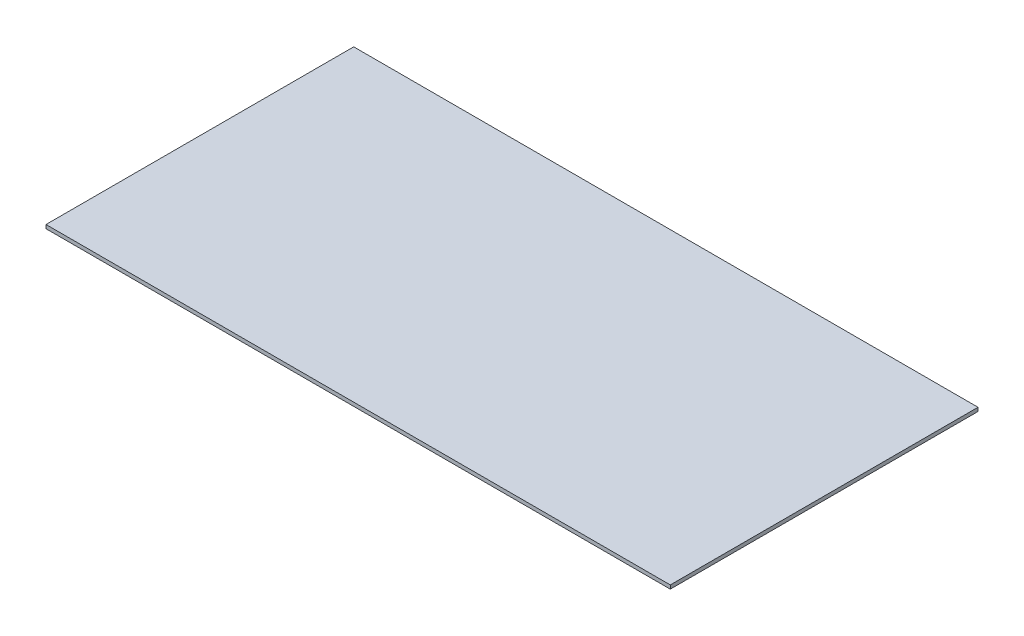
ISO-10303-21;
HEADER;
FILE_DESCRIPTION(('STEP AP214'),'2;1');
FILE_NAME('part.step','',(''),(''),'','','');
FILE_SCHEMA(('AUTOMOTIVE_DESIGN { 1 0 10303 214 1 1 1 1 }'));
ENDSEC;
DATA;
#1=APPLICATION_CONTEXT('core data for automotive mechanical design processes');
#2=APPLICATION_PROTOCOL_DEFINITION('international standard','automotive_design',2000,#1);
#3=PRODUCT_CONTEXT('',#1,'mechanical');
#4=PRODUCT('Part','Part','',(#3));
#5=PRODUCT_RELATED_PRODUCT_CATEGORY('part','',(#4));
#6=PRODUCT_DEFINITION_FORMATION('','',#4);
#7=PRODUCT_DEFINITION_CONTEXT('part definition',#1,'design');
#8=PRODUCT_DEFINITION('design','',#6,#7);
#9=PRODUCT_DEFINITION_SHAPE('','',#8);
#10=(LENGTH_UNIT() NAMED_UNIT(*) SI_UNIT(.MILLI.,.METRE.));
#11=(NAMED_UNIT(*) PLANE_ANGLE_UNIT() SI_UNIT($,.RADIAN.));
#12=(NAMED_UNIT(*) SI_UNIT($,.STERADIAN.) SOLID_ANGLE_UNIT());
#13=UNCERTAINTY_MEASURE_WITH_UNIT(LENGTH_MEASURE(1.E-05),#10,'distance_accuracy_value','');
#14=(GEOMETRIC_REPRESENTATION_CONTEXT(3) GLOBAL_UNCERTAINTY_ASSIGNED_CONTEXT((#13)) GLOBAL_UNIT_ASSIGNED_CONTEXT((#10,
#11,#12)) REPRESENTATION_CONTEXT('',''));
#15=CARTESIAN_POINT('',(0.,0.,0.));
#16=DIRECTION('',(0.,0.,1.));
#17=DIRECTION('',(1.,0.,0.));
#18=AXIS2_PLACEMENT_3D('',#15,#16,#17);
#19=CARTESIAN_POINT('',(0.,1.5875,0.));
#20=DIRECTION('',(1.,0.,0.));
#21=DIRECTION('',(0.,0.,-1.));
#22=AXIS2_PLACEMENT_3D('',#19,#20,#21);
#23=PLANE('',#22);
#24=DIRECTION('',(0.,0.,1.));
#25=VECTOR('',#24,1.);
#26=CARTESIAN_POINT('',(0.,0.,0.));
#27=LINE('',#26,#25);
#28=CARTESIAN_POINT('',(0.,0.,-132.588));
#29=VERTEX_POINT('',#28);
#30=CARTESIAN_POINT('',(0.,0.,0.));
#31=VERTEX_POINT('',#30);
#32=EDGE_CURVE('E96',#29,#31,#27,.T.);
#33=ORIENTED_EDGE('',*,*,#32,.T.);
#34=DIRECTION('',(0.,-1.,0.));
#35=VECTOR('',#34,1.);
#36=CARTESIAN_POINT('',(0.,1.5875,0.));
#37=LINE('',#36,#35);
#38=CARTESIAN_POINT('',(0.,1.5875,0.));
#39=VERTEX_POINT('',#38);
#40=EDGE_CURVE('E11',#39,#31,#37,.T.);
#41=ORIENTED_EDGE('',*,*,#40,.F.);
#42=DIRECTION('',(0.,0.,1.));
#43=VECTOR('',#42,1.);
#44=CARTESIAN_POINT('',(0.,1.5875,0.));
#45=LINE('',#44,#43);
#46=CARTESIAN_POINT('',(0.,1.5875,-132.588));
#47=VERTEX_POINT('',#46);
#48=EDGE_CURVE('E84',#47,#39,#45,.T.);
#49=ORIENTED_EDGE('',*,*,#48,.F.);
#50=DIRECTION('',(0.,-1.,0.));
#51=VECTOR('',#50,1.);
#52=CARTESIAN_POINT('',(0.,1.5875,-132.588));
#53=LINE('',#52,#51);
#54=EDGE_CURVE('E92',#47,#29,#53,.T.);
#55=ORIENTED_EDGE('',*,*,#54,.T.);
#56=EDGE_LOOP('',(#33,#41,#49,#55));
#57=FACE_BOUND('',#56,.T.);
#58=ADVANCED_FACE('F33',(#57),#23,.F.);
#59=CARTESIAN_POINT('',(0.,1.5875,0.));
#60=DIRECTION('',(0.,0.,-1.));
#61=DIRECTION('',(-1.,0.,0.));
#62=AXIS2_PLACEMENT_3D('',#59,#60,#61);
#63=PLANE('',#62);
#64=DIRECTION('',(1.,0.,0.));
#65=VECTOR('',#64,1.);
#66=CARTESIAN_POINT('',(0.,0.,0.));
#67=LINE('',#66,#65);
#68=CARTESIAN_POINT('',(268.986,0.,0.));
#69=VERTEX_POINT('',#68);
#70=EDGE_CURVE('E88',#31,#69,#67,.T.);
#71=ORIENTED_EDGE('',*,*,#70,.T.);
#72=DIRECTION('',(0.,-1.,0.));
#73=VECTOR('',#72,1.);
#74=CARTESIAN_POINT('',(268.986,1.5875,0.));
#75=LINE('',#74,#73);
#76=CARTESIAN_POINT('',(268.986,1.5875,0.));
#77=VERTEX_POINT('',#76);
#78=EDGE_CURVE('E41',#77,#69,#75,.T.);
#79=ORIENTED_EDGE('',*,*,#78,.F.);
#80=DIRECTION('',(1.,0.,0.));
#81=VECTOR('',#80,1.);
#82=CARTESIAN_POINT('',(0.,1.5875,0.));
#83=LINE('',#82,#81);
#84=EDGE_CURVE('E79',#39,#77,#83,.T.);
#85=ORIENTED_EDGE('',*,*,#84,.F.);
#86=ORIENTED_EDGE('',*,*,#40,.T.);
#87=EDGE_LOOP('',(#71,#79,#85,#86));
#88=FACE_BOUND('',#87,.T.);
#89=ADVANCED_FACE('F87',(#88),#63,.F.);
#90=CARTESIAN_POINT('',(268.986,1.5875,0.));
#91=DIRECTION('',(-1.,0.,0.));
#92=DIRECTION('',(0.,0.,1.));
#93=AXIS2_PLACEMENT_3D('',#90,#91,#92);
#94=PLANE('',#93);
#95=DIRECTION('',(0.,0.,-1.));
#96=VECTOR('',#95,1.);
#97=CARTESIAN_POINT('',(268.986,0.,0.));
#98=LINE('',#97,#96);
#99=CARTESIAN_POINT('',(268.986,0.,-132.588));
#100=VERTEX_POINT('',#99);
#101=EDGE_CURVE('E66',#69,#100,#98,.T.);
#102=ORIENTED_EDGE('',*,*,#101,.T.);
#103=DIRECTION('',(0.,-1.,0.));
#104=VECTOR('',#103,1.);
#105=CARTESIAN_POINT('',(268.986,1.5875,-132.588));
#106=LINE('',#105,#104);
#107=CARTESIAN_POINT('',(268.986,1.5875,-132.588));
#108=VERTEX_POINT('',#107);
#109=EDGE_CURVE('E89',#108,#100,#106,.T.);
#110=ORIENTED_EDGE('',*,*,#109,.F.);
#111=DIRECTION('',(0.,0.,-1.));
#112=VECTOR('',#111,1.);
#113=CARTESIAN_POINT('',(268.986,1.5875,0.));
#114=LINE('',#113,#112);
#115=EDGE_CURVE('E82',#77,#108,#114,.T.);
#116=ORIENTED_EDGE('',*,*,#115,.F.);
#117=ORIENTED_EDGE('',*,*,#78,.T.);
#118=EDGE_LOOP('',(#102,#110,#116,#117));
#119=FACE_BOUND('',#118,.T.);
#120=ADVANCED_FACE('F90',(#119),#94,.F.);
#121=CARTESIAN_POINT('',(0.,1.5875,-132.588));
#122=DIRECTION('',(0.,0.,1.));
#123=DIRECTION('',(1.,0.,0.));
#124=AXIS2_PLACEMENT_3D('',#121,#122,#123);
#125=PLANE('',#124);
#126=DIRECTION('',(-1.,0.,0.));
#127=VECTOR('',#126,1.);
#128=CARTESIAN_POINT('',(0.,0.,-132.588));
#129=LINE('',#128,#127);
#130=EDGE_CURVE('E72',#100,#29,#129,.T.);
#131=ORIENTED_EDGE('',*,*,#130,.T.);
#132=ORIENTED_EDGE('',*,*,#54,.F.);
#133=DIRECTION('',(-1.,0.,0.));
#134=VECTOR('',#133,1.);
#135=CARTESIAN_POINT('',(0.,1.5875,-132.588));
#136=LINE('',#135,#134);
#137=EDGE_CURVE('E49',#108,#47,#136,.T.);
#138=ORIENTED_EDGE('',*,*,#137,.F.);
#139=ORIENTED_EDGE('',*,*,#109,.T.);
#140=EDGE_LOOP('',(#131,#132,#138,#139));
#141=FACE_BOUND('',#140,.T.);
#142=ADVANCED_FACE('F103',(#141),#125,.F.);
#143=CARTESIAN_POINT('',(0.,1.5875,0.));
#144=DIRECTION('',(0.,-1.,0.));
#145=DIRECTION('',(0.,0.,-1.));
#146=AXIS2_PLACEMENT_3D('',#143,#144,#145);
#147=PLANE('',#146);
#148=ORIENTED_EDGE('',*,*,#48,.T.);
#149=ORIENTED_EDGE('',*,*,#84,.T.);
#150=ORIENTED_EDGE('',*,*,#115,.T.);
#151=ORIENTED_EDGE('',*,*,#137,.T.);
#152=EDGE_LOOP('',(#148,#149,#150,#151));
#153=FACE_BOUND('',#152,.T.);
#154=ADVANCED_FACE('F80',(#153),#147,.F.);
#155=CARTESIAN_POINT('',(0.,0.,0.));
#156=DIRECTION('',(0.,-1.,0.));
#157=DIRECTION('',(0.,0.,-1.));
#158=AXIS2_PLACEMENT_3D('',#155,#156,#157);
#159=PLANE('',#158);
#160=ORIENTED_EDGE('',*,*,#32,.F.);
#161=ORIENTED_EDGE('',*,*,#130,.F.);
#162=ORIENTED_EDGE('',*,*,#101,.F.);
#163=ORIENTED_EDGE('',*,*,#70,.F.);
#164=EDGE_LOOP('',(#160,#161,#162,#163));
#165=FACE_BOUND('',#164,.T.);
#166=ADVANCED_FACE('F106',(#165),#159,.T.);
#167=CLOSED_SHELL('',(#58,#89,#120,#142,#154,#166));
#168=MANIFOLD_SOLID_BREP('B2',#167);
#169=ADVANCED_BREP_SHAPE_REPRESENTATION('',(#18,#168),#14);
#170=SHAPE_DEFINITION_REPRESENTATION(#9,#169);
ENDSEC;
END-ISO-10303-21;
